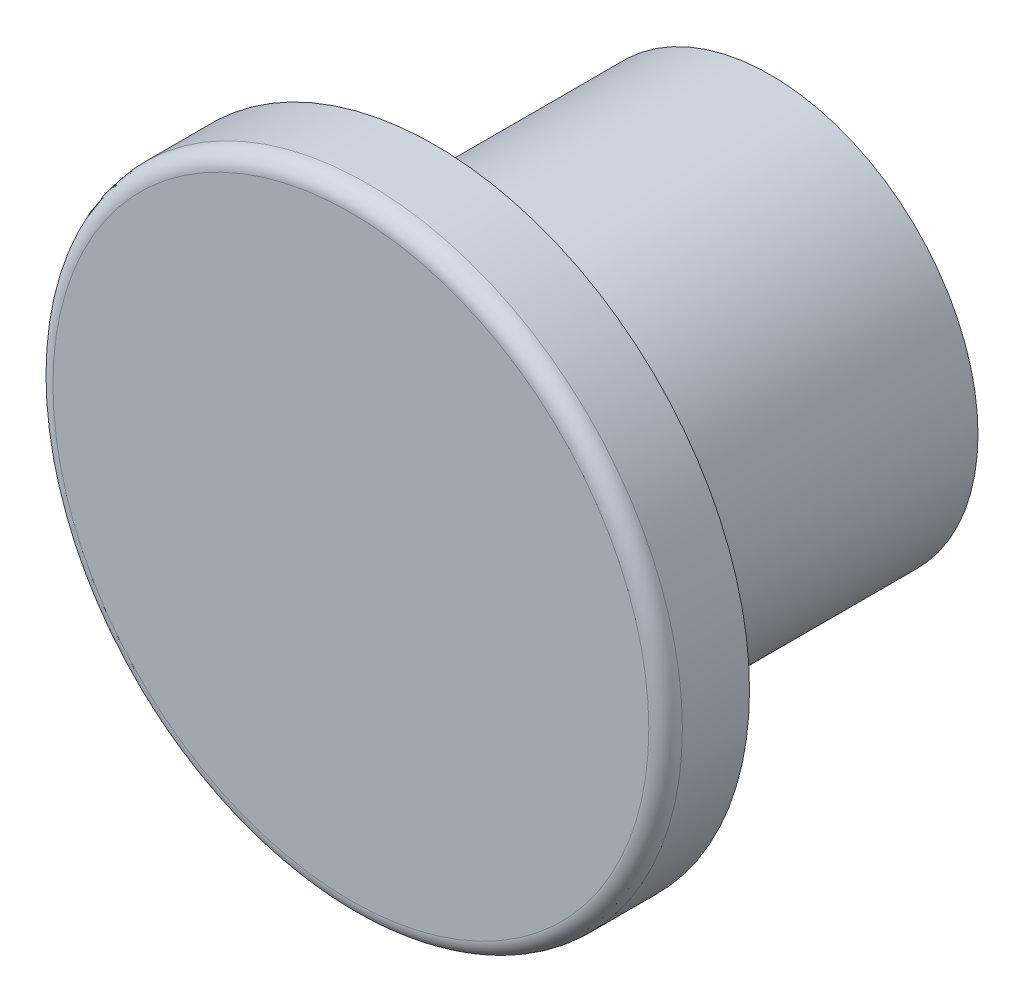
ISO-10303-21;
HEADER;
FILE_DESCRIPTION(('STEP AP214'),'2;1');
FILE_NAME('part.step','',(''),(''),'','','');
FILE_SCHEMA(('AUTOMOTIVE_DESIGN { 1 0 10303 214 1 1 1 1 }'));
ENDSEC;
DATA;
#1=APPLICATION_CONTEXT('core data for automotive mechanical design processes');
#2=APPLICATION_PROTOCOL_DEFINITION('international standard','automotive_design',2000,#1);
#3=PRODUCT_CONTEXT('',#1,'mechanical');
#4=PRODUCT('Part','Part','',(#3));
#5=PRODUCT_RELATED_PRODUCT_CATEGORY('part','',(#4));
#6=PRODUCT_DEFINITION_FORMATION('','',#4);
#7=PRODUCT_DEFINITION_CONTEXT('part definition',#1,'design');
#8=PRODUCT_DEFINITION('design','',#6,#7);
#9=PRODUCT_DEFINITION_SHAPE('','',#8);
#10=(LENGTH_UNIT() NAMED_UNIT(*) SI_UNIT(.MILLI.,.METRE.));
#11=(NAMED_UNIT(*) PLANE_ANGLE_UNIT() SI_UNIT($,.RADIAN.));
#12=(NAMED_UNIT(*) SI_UNIT($,.STERADIAN.) SOLID_ANGLE_UNIT());
#13=UNCERTAINTY_MEASURE_WITH_UNIT(LENGTH_MEASURE(1.E-05),#10,'distance_accuracy_value','');
#14=(GEOMETRIC_REPRESENTATION_CONTEXT(3) GLOBAL_UNCERTAINTY_ASSIGNED_CONTEXT((#13)) GLOBAL_UNIT_ASSIGNED_CONTEXT((#10,
#11,#12)) REPRESENTATION_CONTEXT('',''));
#15=CARTESIAN_POINT('',(0.,0.,0.));
#16=DIRECTION('',(0.,0.,1.));
#17=DIRECTION('',(1.,0.,0.));
#18=AXIS2_PLACEMENT_3D('',#15,#16,#17);
#19=CARTESIAN_POINT('',(0.,0.,-2.));
#20=DIRECTION('',(0.,0.,1.));
#21=DIRECTION('',(1.,0.,0.));
#22=AXIS2_PLACEMENT_3D('',#19,#20,#21);
#23=CYLINDRICAL_SURFACE('',#22,7.5);
#24=CARTESIAN_POINT('',(0.,0.,-0.4));
#25=DIRECTION('',(0.,0.,1.));
#26=DIRECTION('',(1.,0.,0.));
#27=AXIS2_PLACEMENT_3D('',#24,#25,#26);
#28=CIRCLE('',#27,7.5);
#29=CARTESIAN_POINT('',(7.5,0.,-0.4));
#30=VERTEX_POINT('',#29);
#31=EDGE_CURVE('E10',#30,#30,#28,.F.);
#32=ORIENTED_EDGE('',*,*,#31,.T.);
#33=EDGE_LOOP('',(#32));
#34=FACE_BOUND('',#33,.T.);
#35=CARTESIAN_POINT('',(0.,0.,-2.));
#36=DIRECTION('',(0.,0.,1.));
#37=DIRECTION('',(1.,0.,0.));
#38=AXIS2_PLACEMENT_3D('',#35,#36,#37);
#39=CIRCLE('',#38,7.5);
#40=CARTESIAN_POINT('',(7.5,0.,-2.));
#41=VERTEX_POINT('',#40);
#42=EDGE_CURVE('E49',#41,#41,#39,.T.);
#43=ORIENTED_EDGE('',*,*,#42,.T.);
#44=EDGE_LOOP('',(#43));
#45=FACE_BOUND('',#44,.T.);
#46=ADVANCED_FACE('F39',(#34,#45),#23,.T.);
#47=CARTESIAN_POINT('',(0.,0.,-2.));
#48=DIRECTION('',(0.,0.,1.));
#49=DIRECTION('',(1.,0.,0.));
#50=AXIS2_PLACEMENT_3D('',#47,#48,#49);
#51=PLANE('',#50);
#52=CARTESIAN_POINT('',(0.,0.,-2.));
#53=DIRECTION('',(0.,0.,1.));
#54=DIRECTION('',(1.,0.,0.));
#55=AXIS2_PLACEMENT_3D('',#52,#53,#54);
#56=CIRCLE('',#55,4.945);
#57=CARTESIAN_POINT('',(4.945,0.,-2.));
#58=VERTEX_POINT('',#57);
#59=EDGE_CURVE('E53',#58,#58,#56,.T.);
#60=ORIENTED_EDGE('',*,*,#59,.T.);
#61=EDGE_LOOP('',(#60));
#62=FACE_BOUND('',#61,.T.);
#63=ORIENTED_EDGE('',*,*,#42,.F.);
#64=EDGE_LOOP('',(#63));
#65=FACE_BOUND('',#64,.T.);
#66=ADVANCED_FACE('F80',(#62,#65),#51,.F.);
#67=CARTESIAN_POINT('',(0.,0.,0.));
#68=DIRECTION('',(0.,0.,1.));
#69=DIRECTION('',(1.,0.,0.));
#70=AXIS2_PLACEMENT_3D('',#67,#68,#69);
#71=PLANE('',#70);
#72=CARTESIAN_POINT('',(0.,0.,0.));
#73=DIRECTION('',(0.,0.,1.));
#74=DIRECTION('',(1.,0.,0.));
#75=AXIS2_PLACEMENT_3D('',#72,#73,#74);
#76=CIRCLE('',#75,7.1);
#77=CARTESIAN_POINT('',(7.1,0.,0.));
#78=VERTEX_POINT('',#77);
#79=EDGE_CURVE('E46',#78,#78,#76,.T.);
#80=ORIENTED_EDGE('',*,*,#79,.T.);
#81=EDGE_LOOP('',(#80));
#82=FACE_BOUND('',#81,.T.);
#83=ADVANCED_FACE('F73',(#82),#71,.T.);
#84=CARTESIAN_POINT('',(0.,0.,-10.));
#85=DIRECTION('',(0.,0.,1.));
#86=DIRECTION('',(1.,0.,0.));
#87=AXIS2_PLACEMENT_3D('',#84,#85,#86);
#88=CYLINDRICAL_SURFACE('',#87,4.945);
#89=CARTESIAN_POINT('',(0.,0.,-10.));
#90=DIRECTION('',(0.,0.,1.));
#91=DIRECTION('',(1.,0.,0.));
#92=AXIS2_PLACEMENT_3D('',#89,#90,#91);
#93=CIRCLE('',#92,4.945);
#94=CARTESIAN_POINT('',(4.945,0.,-10.));
#95=VERTEX_POINT('',#94);
#96=EDGE_CURVE('E56',#95,#95,#93,.T.);
#97=ORIENTED_EDGE('',*,*,#96,.T.);
#98=EDGE_LOOP('',(#97));
#99=FACE_BOUND('',#98,.T.);
#100=ORIENTED_EDGE('',*,*,#59,.F.);
#101=EDGE_LOOP('',(#100));
#102=FACE_BOUND('',#101,.T.);
#103=ADVANCED_FACE('F62',(#99,#102),#88,.T.);
#104=CARTESIAN_POINT('',(0.,0.,-10.));
#105=DIRECTION('',(0.,0.,1.));
#106=DIRECTION('',(1.,0.,0.));
#107=AXIS2_PLACEMENT_3D('',#104,#105,#106);
#108=PLANE('',#107);
#109=ORIENTED_EDGE('',*,*,#96,.F.);
#110=EDGE_LOOP('',(#109));
#111=FACE_BOUND('',#110,.T.);
#112=ADVANCED_FACE('F67',(#111),#108,.F.);
#113=CARTESIAN_POINT('',(0.,0.,-0.4));
#114=DIRECTION('',(0.,0.,1.));
#115=DIRECTION('',(1.,0.,0.));
#116=AXIS2_PLACEMENT_3D('',#113,#114,#115);
#117=TOROIDAL_SURFACE('',#116,7.1,0.4);
#118=ORIENTED_EDGE('',*,*,#31,.F.);
#119=EDGE_LOOP('',(#118));
#120=FACE_BOUND('',#119,.T.);
#121=ORIENTED_EDGE('',*,*,#79,.F.);
#122=EDGE_LOOP('',(#121));
#123=FACE_BOUND('',#122,.T.);
#124=ADVANCED_FACE('F41',(#120,#123),#117,.T.);
#125=CLOSED_SHELL('',(#46,#66,#83,#103,#112,#124));
#126=MANIFOLD_SOLID_BREP('B2',#125);
#127=ADVANCED_BREP_SHAPE_REPRESENTATION('',(#18,#126),#14);
#128=SHAPE_DEFINITION_REPRESENTATION(#9,#127);
ENDSEC;
END-ISO-10303-21;
